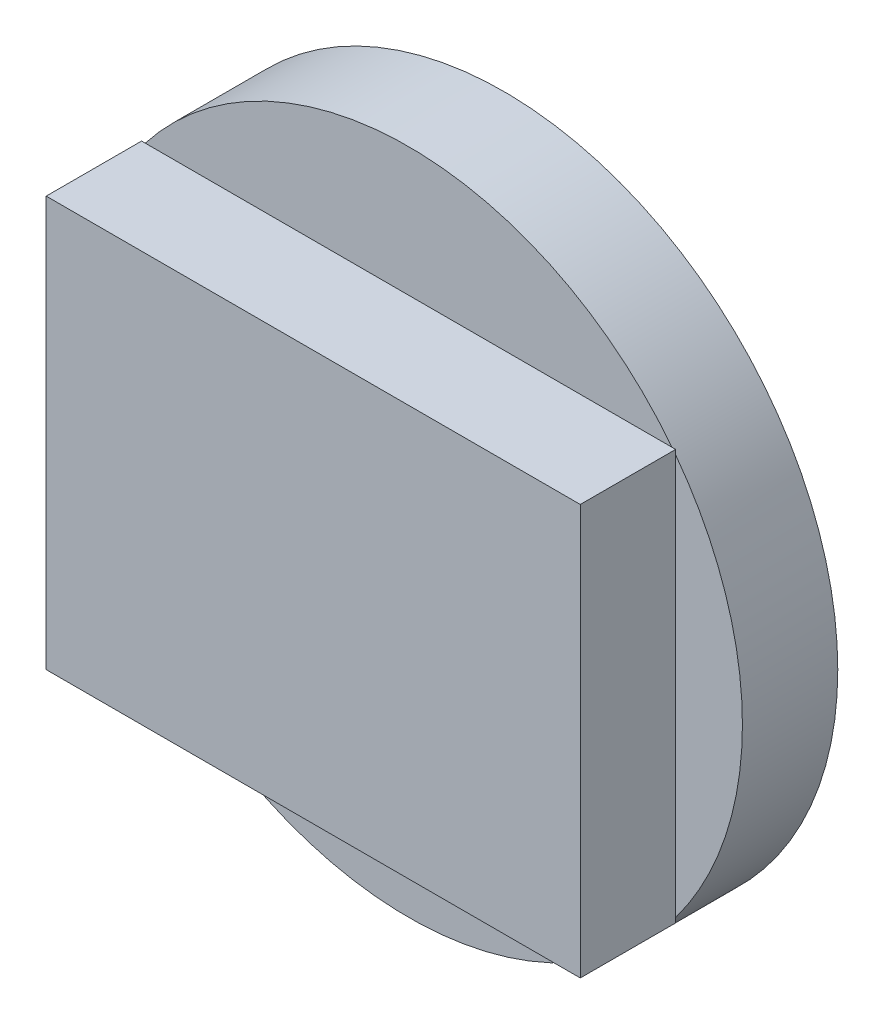
ISO-10303-21;
HEADER;
FILE_DESCRIPTION(('STEP AP214'),'2;1');
FILE_NAME('part.step','',(''),(''),'','','');
FILE_SCHEMA(('AUTOMOTIVE_DESIGN { 1 0 10303 214 1 1 1 1 }'));
ENDSEC;
DATA;
#1=APPLICATION_CONTEXT('core data for automotive mechanical design processes');
#2=APPLICATION_PROTOCOL_DEFINITION('international standard','automotive_design',2000,#1);
#3=PRODUCT_CONTEXT('',#1,'mechanical');
#4=PRODUCT('Part','Part','',(#3));
#5=PRODUCT_RELATED_PRODUCT_CATEGORY('part','',(#4));
#6=PRODUCT_DEFINITION_FORMATION('','',#4);
#7=PRODUCT_DEFINITION_CONTEXT('part definition',#1,'design');
#8=PRODUCT_DEFINITION('design','',#6,#7);
#9=PRODUCT_DEFINITION_SHAPE('','',#8);
#10=(LENGTH_UNIT() NAMED_UNIT(*) SI_UNIT(.MILLI.,.METRE.));
#11=(NAMED_UNIT(*) PLANE_ANGLE_UNIT() SI_UNIT($,.RADIAN.));
#12=(NAMED_UNIT(*) SI_UNIT($,.STERADIAN.) SOLID_ANGLE_UNIT());
#13=UNCERTAINTY_MEASURE_WITH_UNIT(LENGTH_MEASURE(1.E-05),#10,'distance_accuracy_value','');
#14=(GEOMETRIC_REPRESENTATION_CONTEXT(3) GLOBAL_UNCERTAINTY_ASSIGNED_CONTEXT((#13)) GLOBAL_UNIT_ASSIGNED_CONTEXT((#10,
#11,#12)) REPRESENTATION_CONTEXT('',''));
#15=CARTESIAN_POINT('',(0.,0.,0.));
#16=DIRECTION('',(0.,0.,1.));
#17=DIRECTION('',(1.,0.,0.));
#18=AXIS2_PLACEMENT_3D('',#15,#16,#17);
#19=CARTESIAN_POINT('',(0.,0.,0.));
#20=DIRECTION('',(0.,0.,1.));
#21=DIRECTION('',(1.,0.,0.));
#22=AXIS2_PLACEMENT_3D('',#19,#20,#21);
#23=PLANE('',#22);
#24=DIRECTION('',(0.,1.,0.));
#25=VECTOR('',#24,1.);
#26=CARTESIAN_POINT('',(-0.665276253201608,4.83333333333333,0.));
#27=LINE('',#26,#25);
#28=CARTESIAN_POINT('',(-0.665276253201609,4.78333333333333,0.));
#29=VERTEX_POINT('',#28);
#30=CARTESIAN_POINT('',(-0.665276253201608,4.83333333333333,0.));
#31=VERTEX_POINT('',#30);
#32=EDGE_CURVE('E127',#29,#31,#27,.T.);
#33=ORIENTED_EDGE('',*,*,#32,.F.);
#34=CARTESIAN_POINT('',(-3.46527625320161,2.68333333333333,0.));
#35=DIRECTION('',(0.,0.,1.));
#36=DIRECTION('',(1.,0.,0.));
#37=AXIS2_PLACEMENT_3D('',#34,#35,#36);
#38=CIRCLE('',#37,3.5);
#39=CARTESIAN_POINT('',(-0.703483357273313,4.83333333333333,0.));
#40=VERTEX_POINT('',#39);
#41=EDGE_CURVE('E116',#29,#40,#38,.T.);
#42=ORIENTED_EDGE('',*,*,#41,.T.);
#43=DIRECTION('',(-1.,0.,0.));
#44=VECTOR('',#43,1.);
#45=CARTESIAN_POINT('',(-6.26527625320161,4.83333333333333,0.));
#46=LINE('',#45,#44);
#47=EDGE_CURVE('E128',#31,#40,#46,.T.);
#48=ORIENTED_EDGE('',*,*,#47,.F.);
#49=EDGE_LOOP('',(#33,#42,#48));
#50=FACE_BOUND('',#49,.T.);
#51=ADVANCED_FACE('F35',(#50),#23,.F.);
#52=CARTESIAN_POINT('',(-6.2270691491299,4.83333333333333,0.));
#53=VERTEX_POINT('',#52);
#54=CARTESIAN_POINT('',(-6.26527625320161,4.83333333333333,0.));
#55=VERTEX_POINT('',#54);
#56=EDGE_CURVE('E83',#53,#55,#46,.T.);
#57=ORIENTED_EDGE('',*,*,#56,.F.);
#58=CARTESIAN_POINT('',(-6.26527625320161,4.78333333333333,0.));
#59=VERTEX_POINT('',#58);
#60=EDGE_CURVE('E11',#53,#59,#38,.T.);
#61=ORIENTED_EDGE('',*,*,#60,.T.);
#62=DIRECTION('',(0.,-1.,0.));
#63=VECTOR('',#62,1.);
#64=CARTESIAN_POINT('',(-6.26527625320161,4.83333333333333,0.));
#65=LINE('',#64,#63);
#66=EDGE_CURVE('E161',#55,#59,#65,.T.);
#67=ORIENTED_EDGE('',*,*,#66,.F.);
#68=EDGE_LOOP('',(#57,#61,#67));
#69=FACE_BOUND('',#68,.T.);
#70=ADVANCED_FACE('F186',(#69),#23,.F.);
#71=CARTESIAN_POINT('',(-6.26527625320161,0.58333333333333,0.));
#72=VERTEX_POINT('',#71);
#73=CARTESIAN_POINT('',(-6.26527625320161,0.533333333333332,0.));
#74=VERTEX_POINT('',#73);
#75=EDGE_CURVE('E165',#72,#74,#65,.T.);
#76=ORIENTED_EDGE('',*,*,#75,.F.);
#77=CARTESIAN_POINT('',(-6.2270691491299,0.533333333333332,0.));
#78=VERTEX_POINT('',#77);
#79=EDGE_CURVE('E44',#72,#78,#38,.T.);
#80=ORIENTED_EDGE('',*,*,#79,.T.);
#81=DIRECTION('',(1.,0.,0.));
#82=VECTOR('',#81,1.);
#83=CARTESIAN_POINT('',(-6.26527625320161,0.533333333333332,0.));
#84=LINE('',#83,#82);
#85=EDGE_CURVE('E132',#74,#78,#84,.T.);
#86=ORIENTED_EDGE('',*,*,#85,.F.);
#87=EDGE_LOOP('',(#76,#80,#86));
#88=FACE_BOUND('',#87,.T.);
#89=ADVANCED_FACE('F192',(#88),#23,.F.);
#90=CARTESIAN_POINT('',(-6.26527625320161,4.83333333333333,1.));
#91=DIRECTION('',(1.,0.,0.));
#92=DIRECTION('',(0.,1.,0.));
#93=AXIS2_PLACEMENT_3D('',#90,#91,#92);
#94=PLANE('',#93);
#95=ORIENTED_EDGE('',*,*,#66,.T.);
#96=EDGE_CURVE('E164',#59,#72,#65,.T.);
#97=ORIENTED_EDGE('',*,*,#96,.T.);
#98=ORIENTED_EDGE('',*,*,#75,.T.);
#99=DIRECTION('',(0.,0.,-1.));
#100=VECTOR('',#99,1.);
#101=CARTESIAN_POINT('',(-6.26527625320161,0.533333333333332,1.));
#102=LINE('',#101,#100);
#103=CARTESIAN_POINT('',(-6.26527625320161,0.533333333333332,1.));
#104=VERTEX_POINT('',#103);
#105=EDGE_CURVE('E39',#104,#74,#102,.T.);
#106=ORIENTED_EDGE('',*,*,#105,.F.);
#107=DIRECTION('',(0.,-1.,0.));
#108=VECTOR('',#107,1.);
#109=CARTESIAN_POINT('',(-6.26527625320161,4.83333333333333,1.));
#110=LINE('',#109,#108);
#111=CARTESIAN_POINT('',(-6.26527625320161,4.83333333333333,1.));
#112=VERTEX_POINT('',#111);
#113=EDGE_CURVE('E143',#112,#104,#110,.T.);
#114=ORIENTED_EDGE('',*,*,#113,.F.);
#115=DIRECTION('',(0.,0.,-1.));
#116=VECTOR('',#115,1.);
#117=CARTESIAN_POINT('',(-6.26527625320161,4.83333333333333,1.));
#118=LINE('',#117,#116);
#119=EDGE_CURVE('E145',#112,#55,#118,.T.);
#120=ORIENTED_EDGE('',*,*,#119,.T.);
#121=EDGE_LOOP('',(#95,#97,#98,#106,#114,#120));
#122=FACE_BOUND('',#121,.T.);
#123=ADVANCED_FACE('F37',(#122),#94,.F.);
#124=CARTESIAN_POINT('',(-6.26527625320161,0.533333333333332,1.));
#125=DIRECTION('',(0.,1.,0.));
#126=DIRECTION('',(0.,0.,1.));
#127=AXIS2_PLACEMENT_3D('',#124,#125,#126);
#128=PLANE('',#127);
#129=ORIENTED_EDGE('',*,*,#85,.T.);
#130=CARTESIAN_POINT('',(-0.703483357273313,0.533333333333332,0.));
#131=VERTEX_POINT('',#130);
#132=EDGE_CURVE('E169',#78,#131,#84,.T.);
#133=ORIENTED_EDGE('',*,*,#132,.T.);
#134=CARTESIAN_POINT('',(-0.665276253201607,0.533333333333332,0.));
#135=VERTEX_POINT('',#134);
#136=EDGE_CURVE('E163',#131,#135,#84,.T.);
#137=ORIENTED_EDGE('',*,*,#136,.T.);
#138=DIRECTION('',(0.,0.,-1.));
#139=VECTOR('',#138,1.);
#140=CARTESIAN_POINT('',(-0.665276253201607,0.533333333333332,1.));
#141=LINE('',#140,#139);
#142=CARTESIAN_POINT('',(-0.665276253201607,0.533333333333332,1.));
#143=VERTEX_POINT('',#142);
#144=EDGE_CURVE('E148',#143,#135,#141,.T.);
#145=ORIENTED_EDGE('',*,*,#144,.F.);
#146=DIRECTION('',(1.,0.,0.));
#147=VECTOR('',#146,1.);
#148=CARTESIAN_POINT('',(-6.26527625320161,0.533333333333332,1.));
#149=LINE('',#148,#147);
#150=EDGE_CURVE('E91',#104,#143,#149,.T.);
#151=ORIENTED_EDGE('',*,*,#150,.F.);
#152=ORIENTED_EDGE('',*,*,#105,.T.);
#153=EDGE_LOOP('',(#129,#133,#137,#145,#151,#152));
#154=FACE_BOUND('',#153,.T.);
#155=ADVANCED_FACE('F211',(#154),#128,.F.);
#156=CARTESIAN_POINT('',(-0.665276253201608,4.83333333333333,1.));
#157=DIRECTION('',(-1.,0.,0.));
#158=DIRECTION('',(0.,-1.,0.));
#159=AXIS2_PLACEMENT_3D('',#156,#157,#158);
#160=PLANE('',#159);
#161=CARTESIAN_POINT('',(-0.665276253201609,0.583333333333332,0.));
#162=VERTEX_POINT('',#161);
#163=EDGE_CURVE('E134',#135,#162,#27,.T.);
#164=ORIENTED_EDGE('',*,*,#163,.T.);
#165=EDGE_CURVE('E113',#162,#29,#27,.T.);
#166=ORIENTED_EDGE('',*,*,#165,.T.);
#167=ORIENTED_EDGE('',*,*,#32,.T.);
#168=DIRECTION('',(0.,0.,-1.));
#169=VECTOR('',#168,1.);
#170=CARTESIAN_POINT('',(-0.665276253201608,4.83333333333333,1.));
#171=LINE('',#170,#169);
#172=CARTESIAN_POINT('',(-0.665276253201608,4.83333333333333,1.));
#173=VERTEX_POINT('',#172);
#174=EDGE_CURVE('E147',#173,#31,#171,.T.);
#175=ORIENTED_EDGE('',*,*,#174,.F.);
#176=DIRECTION('',(0.,1.,0.));
#177=VECTOR('',#176,1.);
#178=CARTESIAN_POINT('',(-0.665276253201608,4.83333333333333,1.));
#179=LINE('',#178,#177);
#180=EDGE_CURVE('E159',#143,#173,#179,.T.);
#181=ORIENTED_EDGE('',*,*,#180,.F.);
#182=ORIENTED_EDGE('',*,*,#144,.T.);
#183=EDGE_LOOP('',(#164,#166,#167,#175,#181,#182));
#184=FACE_BOUND('',#183,.T.);
#185=ADVANCED_FACE('F136',(#184),#160,.F.);
#186=CARTESIAN_POINT('',(-6.26527625320161,4.83333333333333,1.));
#187=DIRECTION('',(0.,-1.,0.));
#188=DIRECTION('',(0.,0.,-1.));
#189=AXIS2_PLACEMENT_3D('',#186,#187,#188);
#190=PLANE('',#189);
#191=ORIENTED_EDGE('',*,*,#47,.T.);
#192=EDGE_CURVE('E144',#40,#53,#46,.T.);
#193=ORIENTED_EDGE('',*,*,#192,.T.);
#194=ORIENTED_EDGE('',*,*,#56,.T.);
#195=ORIENTED_EDGE('',*,*,#119,.F.);
#196=DIRECTION('',(-1.,0.,0.));
#197=VECTOR('',#196,1.);
#198=CARTESIAN_POINT('',(-6.26527625320161,4.83333333333333,1.));
#199=LINE('',#198,#197);
#200=EDGE_CURVE('E62',#173,#112,#199,.T.);
#201=ORIENTED_EDGE('',*,*,#200,.F.);
#202=ORIENTED_EDGE('',*,*,#174,.T.);
#203=EDGE_LOOP('',(#191,#193,#194,#195,#201,#202));
#204=FACE_BOUND('',#203,.T.);
#205=ADVANCED_FACE('F205',(#204),#190,.F.);
#206=CARTESIAN_POINT('',(0.,0.,1.));
#207=DIRECTION('',(0.,0.,1.));
#208=DIRECTION('',(1.,0.,0.));
#209=AXIS2_PLACEMENT_3D('',#206,#207,#208);
#210=PLANE('',#209);
#211=ORIENTED_EDGE('',*,*,#113,.T.);
#212=ORIENTED_EDGE('',*,*,#150,.T.);
#213=ORIENTED_EDGE('',*,*,#180,.T.);
#214=ORIENTED_EDGE('',*,*,#200,.T.);
#215=EDGE_LOOP('',(#211,#212,#213,#214));
#216=FACE_BOUND('',#215,.T.);
#217=ADVANCED_FACE('F198',(#216),#210,.T.);
#218=ORIENTED_EDGE('',*,*,#136,.F.);
#219=EDGE_CURVE('E126',#131,#162,#38,.T.);
#220=ORIENTED_EDGE('',*,*,#219,.T.);
#221=ORIENTED_EDGE('',*,*,#163,.F.);
#222=EDGE_LOOP('',(#218,#220,#221));
#223=FACE_BOUND('',#222,.T.);
#224=ADVANCED_FACE('F188',(#223),#23,.F.);
#225=CARTESIAN_POINT('',(-3.46527625320161,2.68333333333333,0.));
#226=DIRECTION('',(0.,0.,1.));
#227=DIRECTION('',(1.,0.,0.));
#228=AXIS2_PLACEMENT_3D('',#225,#226,#227);
#229=PLANE('',#228);
#230=ORIENTED_EDGE('',*,*,#96,.F.);
#231=EDGE_CURVE('E214',#59,#72,#38,.T.);
#232=ORIENTED_EDGE('',*,*,#231,.T.);
#233=EDGE_LOOP('',(#230,#232));
#234=FACE_BOUND('',#233,.T.);
#235=ADVANCED_FACE('F197',(#234),#229,.T.);
#236=ORIENTED_EDGE('',*,*,#192,.F.);
#237=EDGE_CURVE('E46',#40,#53,#38,.T.);
#238=ORIENTED_EDGE('',*,*,#237,.T.);
#239=EDGE_LOOP('',(#236,#238));
#240=FACE_BOUND('',#239,.T.);
#241=ADVANCED_FACE('F203',(#240),#229,.T.);
#242=ORIENTED_EDGE('',*,*,#165,.F.);
#243=EDGE_CURVE('E53',#162,#29,#38,.T.);
#244=ORIENTED_EDGE('',*,*,#243,.T.);
#245=EDGE_LOOP('',(#242,#244));
#246=FACE_BOUND('',#245,.T.);
#247=ADVANCED_FACE('F111',(#246),#229,.T.);
#248=ORIENTED_EDGE('',*,*,#132,.F.);
#249=EDGE_CURVE('E115',#78,#131,#38,.T.);
#250=ORIENTED_EDGE('',*,*,#249,.T.);
#251=EDGE_LOOP('',(#248,#250));
#252=FACE_BOUND('',#251,.T.);
#253=ADVANCED_FACE('F182',(#252),#229,.T.);
#254=CARTESIAN_POINT('',(-3.46527625320161,2.68333333333333,-1.));
#255=DIRECTION('',(0.,0.,1.));
#256=DIRECTION('',(1.,0.,0.));
#257=AXIS2_PLACEMENT_3D('',#254,#255,#256);
#258=CYLINDRICAL_SURFACE('',#257,3.5);
#259=CARTESIAN_POINT('',(-3.46527625320161,2.68333333333333,-1.));
#260=DIRECTION('',(0.,0.,1.));
#261=DIRECTION('',(1.,0.,0.));
#262=AXIS2_PLACEMENT_3D('',#259,#260,#261);
#263=CIRCLE('',#262,3.5);
#264=CARTESIAN_POINT('',(0.0347237467983917,2.68333333333333,-1.));
#265=VERTEX_POINT('',#264);
#266=EDGE_CURVE('E125',#265,#265,#263,.T.);
#267=ORIENTED_EDGE('',*,*,#266,.T.);
#268=EDGE_LOOP('',(#267));
#269=FACE_BOUND('',#268,.T.);
#270=ORIENTED_EDGE('',*,*,#41,.F.);
#271=ORIENTED_EDGE('',*,*,#243,.F.);
#272=ORIENTED_EDGE('',*,*,#219,.F.);
#273=ORIENTED_EDGE('',*,*,#249,.F.);
#274=ORIENTED_EDGE('',*,*,#79,.F.);
#275=ORIENTED_EDGE('',*,*,#231,.F.);
#276=ORIENTED_EDGE('',*,*,#60,.F.);
#277=ORIENTED_EDGE('',*,*,#237,.F.);
#278=EDGE_LOOP('',(#270,#271,#272,#273,#274,#275,#276,#277));
#279=FACE_BOUND('',#278,.T.);
#280=ADVANCED_FACE('F120',(#269,#279),#258,.T.);
#281=CARTESIAN_POINT('',(-3.46527625320161,2.68333333333333,-1.));
#282=DIRECTION('',(0.,0.,1.));
#283=DIRECTION('',(1.,0.,0.));
#284=AXIS2_PLACEMENT_3D('',#281,#282,#283);
#285=PLANE('',#284);
#286=ORIENTED_EDGE('',*,*,#266,.F.);
#287=EDGE_LOOP('',(#286));
#288=FACE_BOUND('',#287,.T.);
#289=ADVANCED_FACE('F176',(#288),#285,.F.);
#290=CLOSED_SHELL('',(#51,#70,#89,#123,#155,#185,#205,#217,#224,#235,#241,#247,#253,#280,#289));
#291=MANIFOLD_SOLID_BREP('B2',#290);
#292=ADVANCED_BREP_SHAPE_REPRESENTATION('',(#18,#291),#14);
#293=SHAPE_DEFINITION_REPRESENTATION(#9,#292);
ENDSEC;
END-ISO-10303-21;
